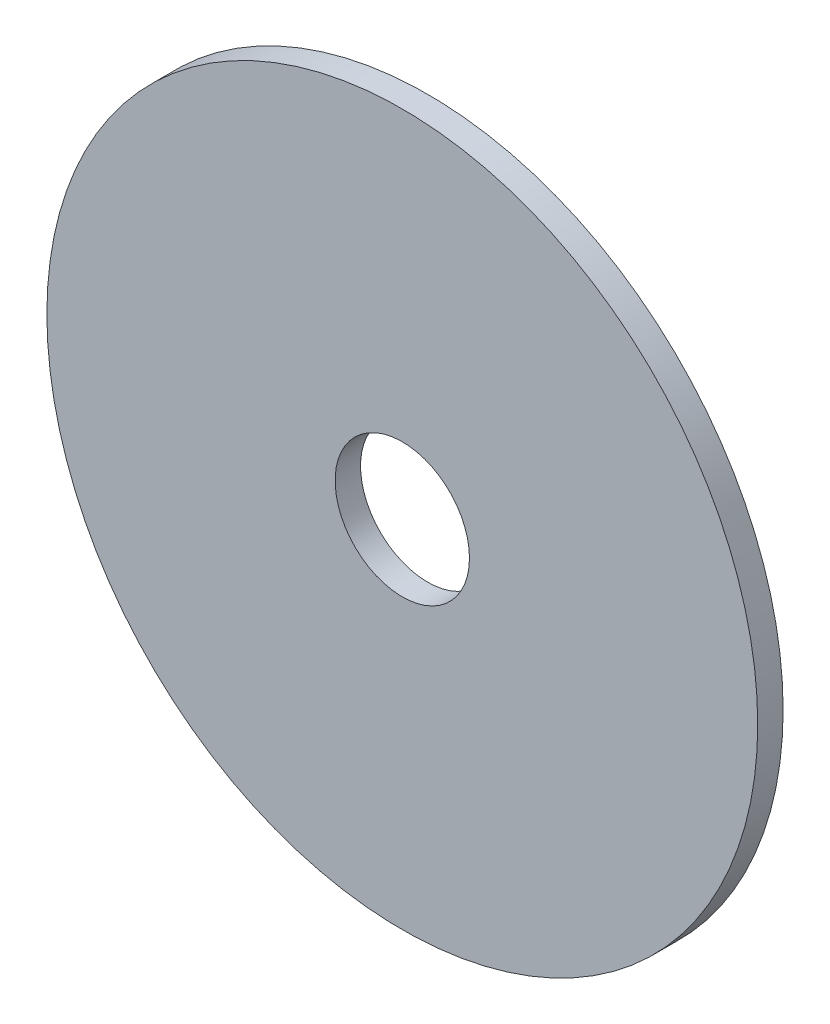
ISO-10303-21;
HEADER;
FILE_DESCRIPTION(('STEP AP214'),'2;1');
FILE_NAME('part.step','',(''),(''),'','','');
FILE_SCHEMA(('AUTOMOTIVE_DESIGN { 1 0 10303 214 1 1 1 1 }'));
ENDSEC;
DATA;
#1=APPLICATION_CONTEXT('core data for automotive mechanical design processes');
#2=APPLICATION_PROTOCOL_DEFINITION('international standard','automotive_design',2000,#1);
#3=PRODUCT_CONTEXT('',#1,'mechanical');
#4=PRODUCT('Part','Part','',(#3));
#5=PRODUCT_RELATED_PRODUCT_CATEGORY('part','',(#4));
#6=PRODUCT_DEFINITION_FORMATION('','',#4);
#7=PRODUCT_DEFINITION_CONTEXT('part definition',#1,'design');
#8=PRODUCT_DEFINITION('design','',#6,#7);
#9=PRODUCT_DEFINITION_SHAPE('','',#8);
#10=(LENGTH_UNIT() NAMED_UNIT(*) SI_UNIT(.MILLI.,.METRE.));
#11=(NAMED_UNIT(*) PLANE_ANGLE_UNIT() SI_UNIT($,.RADIAN.));
#12=(NAMED_UNIT(*) SI_UNIT($,.STERADIAN.) SOLID_ANGLE_UNIT());
#13=UNCERTAINTY_MEASURE_WITH_UNIT(LENGTH_MEASURE(1.E-05),#10,'distance_accuracy_value','');
#14=(GEOMETRIC_REPRESENTATION_CONTEXT(3) GLOBAL_UNCERTAINTY_ASSIGNED_CONTEXT((#13)) GLOBAL_UNIT_ASSIGNED_CONTEXT((#10,
#11,#12)) REPRESENTATION_CONTEXT('',''));
#15=CARTESIAN_POINT('',(0.,0.,0.));
#16=DIRECTION('',(0.,0.,1.));
#17=DIRECTION('',(1.,0.,0.));
#18=AXIS2_PLACEMENT_3D('',#15,#16,#17);
#19=CARTESIAN_POINT('',(0.,0.,1.5875));
#20=DIRECTION('',(0.,0.,1.));
#21=DIRECTION('',(1.,0.,0.));
#22=AXIS2_PLACEMENT_3D('',#19,#20,#21);
#23=PLANE('',#22);
#24=CARTESIAN_POINT('',(0.,0.,1.5875));
#25=DIRECTION('',(0.,0.,1.));
#26=DIRECTION('',(1.,0.,0.));
#27=AXIS2_PLACEMENT_3D('',#24,#25,#26);
#28=CIRCLE('',#27,22.225);
#29=CARTESIAN_POINT('',(22.225,0.,1.5875));
#30=VERTEX_POINT('',#29);
#31=EDGE_CURVE('E10',#30,#30,#28,.T.);
#32=ORIENTED_EDGE('',*,*,#31,.T.);
#33=EDGE_LOOP('',(#32));
#34=FACE_BOUND('',#33,.T.);
#35=CARTESIAN_POINT('',(0.,0.,1.5875));
#36=DIRECTION('',(0.,0.,1.));
#37=DIRECTION('',(1.,0.,0.));
#38=AXIS2_PLACEMENT_3D('',#35,#36,#37);
#39=CIRCLE('',#38,4.2);
#40=CARTESIAN_POINT('',(4.2,0.,1.5875));
#41=VERTEX_POINT('',#40);
#42=EDGE_CURVE('E56',#41,#41,#39,.T.);
#43=ORIENTED_EDGE('',*,*,#42,.F.);
#44=EDGE_LOOP('',(#43));
#45=FACE_BOUND('',#44,.T.);
#46=ADVANCED_FACE('F43',(#34,#45),#23,.T.);
#47=CARTESIAN_POINT('',(0.,0.,0.));
#48=DIRECTION('',(0.,0.,1.));
#49=DIRECTION('',(1.,0.,0.));
#50=AXIS2_PLACEMENT_3D('',#47,#48,#49);
#51=PLANE('',#50);
#52=CARTESIAN_POINT('',(0.,0.,0.));
#53=DIRECTION('',(0.,0.,1.));
#54=DIRECTION('',(1.,0.,0.));
#55=AXIS2_PLACEMENT_3D('',#52,#53,#54);
#56=CIRCLE('',#55,22.225);
#57=CARTESIAN_POINT('',(22.225,0.,0.));
#58=VERTEX_POINT('',#57);
#59=EDGE_CURVE('E47',#58,#58,#56,.T.);
#60=ORIENTED_EDGE('',*,*,#59,.F.);
#61=EDGE_LOOP('',(#60));
#62=FACE_BOUND('',#61,.T.);
#63=CARTESIAN_POINT('',(0.,0.,0.));
#64=DIRECTION('',(0.,0.,1.));
#65=DIRECTION('',(1.,0.,0.));
#66=AXIS2_PLACEMENT_3D('',#63,#64,#65);
#67=CIRCLE('',#66,4.2);
#68=CARTESIAN_POINT('',(4.2,0.,0.));
#69=VERTEX_POINT('',#68);
#70=EDGE_CURVE('E58',#69,#69,#67,.T.);
#71=ORIENTED_EDGE('',*,*,#70,.T.);
#72=EDGE_LOOP('',(#71));
#73=FACE_BOUND('',#72,.T.);
#74=ADVANCED_FACE('F70',(#62,#73),#51,.F.);
#75=CARTESIAN_POINT('',(0.,0.,1.5875));
#76=DIRECTION('',(0.,0.,-1.));
#77=DIRECTION('',(-1.,0.,0.));
#78=AXIS2_PLACEMENT_3D('',#75,#76,#77);
#79=CYLINDRICAL_SURFACE('',#78,22.225);
#80=ORIENTED_EDGE('',*,*,#31,.F.);
#81=EDGE_LOOP('',(#80));
#82=FACE_BOUND('',#81,.T.);
#83=ORIENTED_EDGE('',*,*,#59,.T.);
#84=EDGE_LOOP('',(#83));
#85=FACE_BOUND('',#84,.T.);
#86=ADVANCED_FACE('F45',(#82,#85),#79,.T.);
#87=CARTESIAN_POINT('',(0.,0.,1.5875));
#88=DIRECTION('',(0.,0.,-1.));
#89=DIRECTION('',(-1.,0.,0.));
#90=AXIS2_PLACEMENT_3D('',#87,#88,#89);
#91=CYLINDRICAL_SURFACE('',#90,4.2);
#92=ORIENTED_EDGE('',*,*,#42,.T.);
#93=EDGE_LOOP('',(#92));
#94=FACE_BOUND('',#93,.T.);
#95=ORIENTED_EDGE('',*,*,#70,.F.);
#96=EDGE_LOOP('',(#95));
#97=FACE_BOUND('',#96,.T.);
#98=ADVANCED_FACE('F66',(#94,#97),#91,.F.);
#99=CLOSED_SHELL('',(#46,#74,#86,#98));
#100=MANIFOLD_SOLID_BREP('B2',#99);
#101=ADVANCED_BREP_SHAPE_REPRESENTATION('',(#18,#100),#14);
#102=SHAPE_DEFINITION_REPRESENTATION(#9,#101);
ENDSEC;
END-ISO-10303-21;
